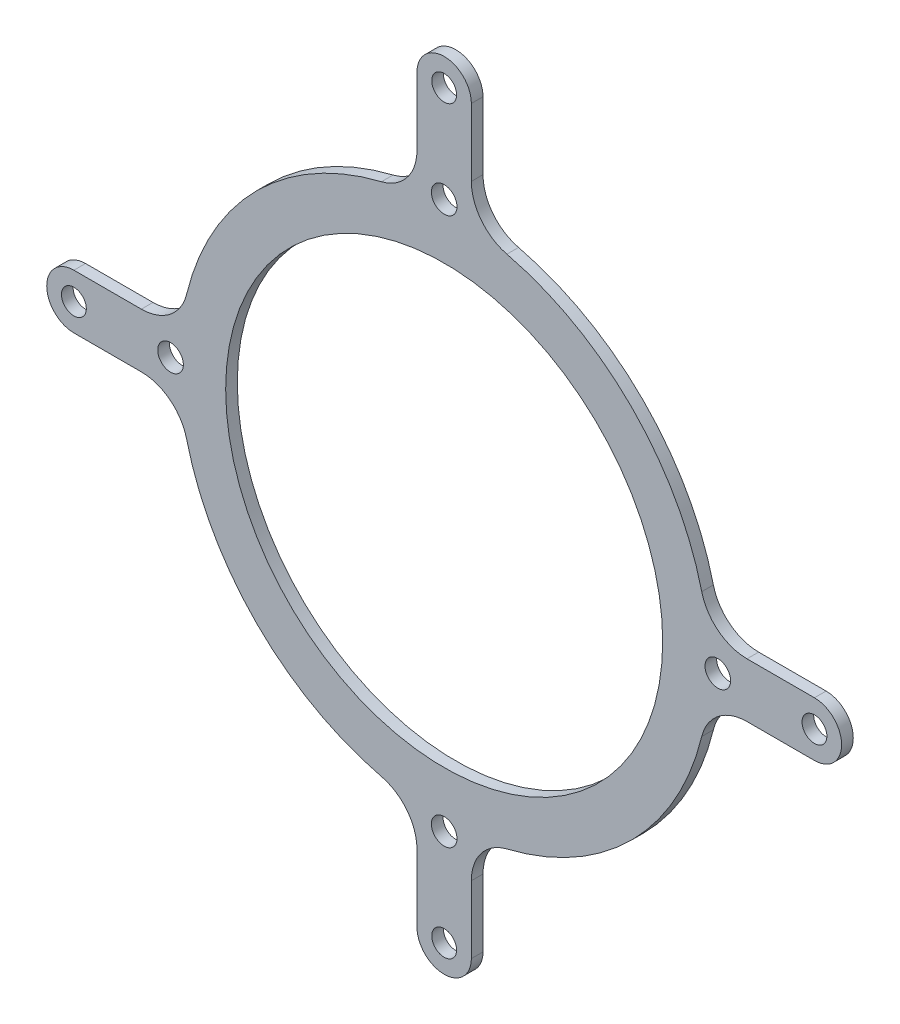
ISO-10303-21;
HEADER;
FILE_DESCRIPTION(('STEP AP214'),'2;1');
FILE_NAME('part.step','',(''),(''),'','','');
FILE_SCHEMA(('AUTOMOTIVE_DESIGN { 1 0 10303 214 1 1 1 1 }'));
ENDSEC;
DATA;
#1=APPLICATION_CONTEXT('core data for automotive mechanical design processes');
#2=APPLICATION_PROTOCOL_DEFINITION('international standard','automotive_design',2000,#1);
#3=PRODUCT_CONTEXT('',#1,'mechanical');
#4=PRODUCT('Part','Part','',(#3));
#5=PRODUCT_RELATED_PRODUCT_CATEGORY('part','',(#4));
#6=PRODUCT_DEFINITION_FORMATION('','',#4);
#7=PRODUCT_DEFINITION_CONTEXT('part definition',#1,'design');
#8=PRODUCT_DEFINITION('design','',#6,#7);
#9=PRODUCT_DEFINITION_SHAPE('','',#8);
#10=(LENGTH_UNIT() NAMED_UNIT(*) SI_UNIT(.MILLI.,.METRE.));
#11=(NAMED_UNIT(*) PLANE_ANGLE_UNIT() SI_UNIT($,.RADIAN.));
#12=(NAMED_UNIT(*) SI_UNIT($,.STERADIAN.) SOLID_ANGLE_UNIT());
#13=UNCERTAINTY_MEASURE_WITH_UNIT(LENGTH_MEASURE(1.E-05),#10,'distance_accuracy_value','');
#14=(GEOMETRIC_REPRESENTATION_CONTEXT(3) GLOBAL_UNCERTAINTY_ASSIGNED_CONTEXT((#13)) GLOBAL_UNIT_ASSIGNED_CONTEXT((#10,
#11,#12)) REPRESENTATION_CONTEXT('',''));
#15=CARTESIAN_POINT('',(0.,0.,0.));
#16=DIRECTION('',(0.,0.,1.));
#17=DIRECTION('',(1.,0.,0.));
#18=AXIS2_PLACEMENT_3D('',#15,#16,#17);
#19=CARTESIAN_POINT('',(0.,0.,1.5));
#20=DIRECTION('',(0.,0.,-1.));
#21=DIRECTION('',(-1.,0.,0.));
#22=AXIS2_PLACEMENT_3D('',#19,#20,#21);
#23=CYLINDRICAL_SURFACE('',#22,34.15);
#24=CARTESIAN_POINT('',(0.,0.,1.5));
#25=DIRECTION('',(0.,0.,1.));
#26=DIRECTION('',(1.,0.,0.));
#27=AXIS2_PLACEMENT_3D('',#24,#25,#26);
#28=CIRCLE('',#27,34.15);
#29=CARTESIAN_POINT('',(-8.08032378580324,33.180278291729,1.5));
#30=VERTEX_POINT('',#29);
#31=CARTESIAN_POINT('',(-33.180278291729,8.08032378580323,1.5));
#32=VERTEX_POINT('',#31);
#33=EDGE_CURVE('E224',#30,#32,#28,.T.);
#34=ORIENTED_EDGE('',*,*,#33,.F.);
#35=DIRECTION('',(0.,0.,-1.));
#36=VECTOR('',#35,1.);
#37=CARTESIAN_POINT('',(-8.08032378580324,33.180278291729,1.5));
#38=LINE('',#37,#36);
#39=CARTESIAN_POINT('',(-8.08032378580324,33.180278291729,0.));
#40=VERTEX_POINT('',#39);
#41=EDGE_CURVE('E339',#30,#40,#38,.T.);
#42=ORIENTED_EDGE('',*,*,#41,.T.);
#43=CARTESIAN_POINT('',(0.,0.,0.));
#44=DIRECTION('',(0.,0.,1.));
#45=DIRECTION('',(1.,0.,0.));
#46=AXIS2_PLACEMENT_3D('',#43,#44,#45);
#47=CIRCLE('',#46,34.15);
#48=CARTESIAN_POINT('',(-33.180278291729,8.08032378580323,0.));
#49=VERTEX_POINT('',#48);
#50=EDGE_CURVE('E279',#40,#49,#47,.T.);
#51=ORIENTED_EDGE('',*,*,#50,.T.);
#52=DIRECTION('',(0.,0.,-1.));
#53=VECTOR('',#52,1.);
#54=CARTESIAN_POINT('',(-33.180278291729,8.08032378580323,1.5));
#55=LINE('',#54,#53);
#56=EDGE_CURVE('E210',#49,#32,#55,.F.);
#57=ORIENTED_EDGE('',*,*,#56,.T.);
#58=EDGE_LOOP('',(#34,#42,#51,#57));
#59=FACE_BOUND('',#58,.T.);
#60=ADVANCED_FACE('F40',(#59),#23,.T.);
#61=CARTESIAN_POINT('',(0.,3.5,1.5));
#62=DIRECTION('',(0.,1.,0.));
#63=DIRECTION('',(-1.,0.,0.));
#64=AXIS2_PLACEMENT_3D('',#61,#62,#63);
#65=PLANE('',#64);
#66=DIRECTION('',(1.,0.,0.));
#67=VECTOR('',#66,1.);
#68=CARTESIAN_POINT('',(0.,3.5,1.5));
#69=LINE('',#68,#67);
#70=CARTESIAN_POINT('',(-47.7,3.49999999999999,1.5));
#71=VERTEX_POINT('',#70);
#72=CARTESIAN_POINT('',(-39.0099025889581,3.49999999999999,1.5));
#73=VERTEX_POINT('',#72);
#74=EDGE_CURVE('E205',#71,#73,#69,.T.);
#75=ORIENTED_EDGE('',*,*,#74,.T.);
#76=DIRECTION('',(0.,0.,-1.));
#77=VECTOR('',#76,1.);
#78=CARTESIAN_POINT('',(-39.0099025889581,3.49999999999999,1.5));
#79=LINE('',#78,#77);
#80=CARTESIAN_POINT('',(-39.0099025889581,3.49999999999999,0.));
#81=VERTEX_POINT('',#80);
#82=EDGE_CURVE('E374',#73,#81,#79,.T.);
#83=ORIENTED_EDGE('',*,*,#82,.T.);
#84=DIRECTION('',(1.,0.,0.));
#85=VECTOR('',#84,1.);
#86=CARTESIAN_POINT('',(0.,3.5,0.));
#87=LINE('',#86,#85);
#88=CARTESIAN_POINT('',(-47.7,3.49999999999999,0.));
#89=VERTEX_POINT('',#88);
#90=EDGE_CURVE('E207',#89,#81,#87,.T.);
#91=ORIENTED_EDGE('',*,*,#90,.F.);
#92=DIRECTION('',(0.,0.,-1.));
#93=VECTOR('',#92,1.);
#94=CARTESIAN_POINT('',(-47.7,3.49999999999999,1.5));
#95=LINE('',#94,#93);
#96=EDGE_CURVE('E202',#71,#89,#95,.T.);
#97=ORIENTED_EDGE('',*,*,#96,.F.);
#98=EDGE_LOOP('',(#75,#83,#91,#97));
#99=FACE_BOUND('',#98,.T.);
#100=ADVANCED_FACE('F204',(#99),#65,.T.);
#101=CARTESIAN_POINT('',(-47.7,0.,1.5));
#102=DIRECTION('',(0.,0.,-1.));
#103=DIRECTION('',(-1.,0.,0.));
#104=AXIS2_PLACEMENT_3D('',#101,#102,#103);
#105=CYLINDRICAL_SURFACE('',#104,3.49999999999999);
#106=CARTESIAN_POINT('',(-47.7,0.,0.));
#107=DIRECTION('',(0.,0.,1.));
#108=DIRECTION('',(1.,0.,0.));
#109=AXIS2_PLACEMENT_3D('',#106,#107,#108);
#110=CIRCLE('',#109,3.49999999999999);
#111=CARTESIAN_POINT('',(-47.7,-3.49999999999999,0.));
#112=VERTEX_POINT('',#111);
#113=EDGE_CURVE('E281',#89,#112,#110,.T.);
#114=ORIENTED_EDGE('',*,*,#113,.T.);
#115=DIRECTION('',(0.,0.,-1.));
#116=VECTOR('',#115,1.);
#117=CARTESIAN_POINT('',(-47.7,-3.49999999999999,1.5));
#118=LINE('',#117,#116);
#119=CARTESIAN_POINT('',(-47.7,-3.49999999999999,1.5));
#120=VERTEX_POINT('',#119);
#121=EDGE_CURVE('E211',#120,#112,#118,.T.);
#122=ORIENTED_EDGE('',*,*,#121,.F.);
#123=CARTESIAN_POINT('',(-47.7,0.,1.5));
#124=DIRECTION('',(0.,0.,1.));
#125=DIRECTION('',(1.,0.,0.));
#126=AXIS2_PLACEMENT_3D('',#123,#124,#125);
#127=CIRCLE('',#126,3.49999999999999);
#128=EDGE_CURVE('E214',#71,#120,#127,.T.);
#129=ORIENTED_EDGE('',*,*,#128,.F.);
#130=ORIENTED_EDGE('',*,*,#96,.T.);
#131=EDGE_LOOP('',(#114,#122,#129,#130));
#132=FACE_BOUND('',#131,.T.);
#133=ADVANCED_FACE('F215',(#132),#105,.T.);
#134=CARTESIAN_POINT('',(0.,-3.49999999999997,1.5));
#135=DIRECTION('',(0.,1.,0.));
#136=DIRECTION('',(-1.,0.,0.));
#137=AXIS2_PLACEMENT_3D('',#134,#135,#136);
#138=PLANE('',#137);
#139=DIRECTION('',(1.,0.,0.));
#140=VECTOR('',#139,1.);
#141=CARTESIAN_POINT('',(0.,-3.49999999999997,0.));
#142=LINE('',#141,#140);
#143=CARTESIAN_POINT('',(-39.0099025889581,-3.49999999999998,0.));
#144=VERTEX_POINT('',#143);
#145=EDGE_CURVE('E277',#112,#144,#142,.T.);
#146=ORIENTED_EDGE('',*,*,#145,.T.);
#147=DIRECTION('',(0.,0.,1.));
#148=VECTOR('',#147,1.);
#149=CARTESIAN_POINT('',(-39.0099025889581,-3.49999999999998,1.5));
#150=LINE('',#149,#148);
#151=CARTESIAN_POINT('',(-39.0099025889581,-3.49999999999998,1.5));
#152=VERTEX_POINT('',#151);
#153=EDGE_CURVE('E372',#144,#152,#150,.T.);
#154=ORIENTED_EDGE('',*,*,#153,.T.);
#155=DIRECTION('',(1.,0.,0.));
#156=VECTOR('',#155,1.);
#157=CARTESIAN_POINT('',(0.,-3.49999999999997,1.5));
#158=LINE('',#157,#156);
#159=EDGE_CURVE('E219',#120,#152,#158,.T.);
#160=ORIENTED_EDGE('',*,*,#159,.F.);
#161=ORIENTED_EDGE('',*,*,#121,.T.);
#162=EDGE_LOOP('',(#146,#154,#160,#161));
#163=FACE_BOUND('',#162,.T.);
#164=ADVANCED_FACE('F519',(#163),#138,.F.);
#165=CARTESIAN_POINT('',(-33.180278291729,-8.08032378580323,0.));
#166=VERTEX_POINT('',#165);
#167=CARTESIAN_POINT('',(-8.08032378580323,-33.180278291729,0.));
#168=VERTEX_POINT('',#167);
#169=EDGE_CURVE('E273',#166,#168,#47,.T.);
#170=ORIENTED_EDGE('',*,*,#169,.T.);
#171=DIRECTION('',(0.,0.,-1.));
#172=VECTOR('',#171,1.);
#173=CARTESIAN_POINT('',(-8.08032378580323,-33.180278291729,1.5));
#174=LINE('',#173,#172);
#175=CARTESIAN_POINT('',(-8.08032378580323,-33.180278291729,1.5));
#176=VERTEX_POINT('',#175);
#177=EDGE_CURVE('E370',#168,#176,#174,.F.);
#178=ORIENTED_EDGE('',*,*,#177,.T.);
#179=CARTESIAN_POINT('',(-33.180278291729,-8.08032378580323,1.5));
#180=VERTEX_POINT('',#179);
#181=EDGE_CURVE('E228',#180,#176,#28,.T.);
#182=ORIENTED_EDGE('',*,*,#181,.F.);
#183=DIRECTION('',(0.,0.,-1.));
#184=VECTOR('',#183,1.);
#185=CARTESIAN_POINT('',(-33.180278291729,-8.08032378580323,1.5));
#186=LINE('',#185,#184);
#187=EDGE_CURVE('E367',#180,#166,#186,.T.);
#188=ORIENTED_EDGE('',*,*,#187,.T.);
#189=EDGE_LOOP('',(#170,#178,#182,#188));
#190=FACE_BOUND('',#189,.T.);
#191=ADVANCED_FACE('F510',(#190),#23,.T.);
#192=CARTESIAN_POINT('',(-3.5,0.,1.5));
#193=DIRECTION('',(-1.,0.,0.));
#194=DIRECTION('',(0.,-1.,0.));
#195=AXIS2_PLACEMENT_3D('',#192,#193,#194);
#196=PLANE('',#195);
#197=DIRECTION('',(0.,1.,0.));
#198=VECTOR('',#197,1.);
#199=CARTESIAN_POINT('',(-3.5,0.,1.5));
#200=LINE('',#199,#198);
#201=CARTESIAN_POINT('',(-3.49999999999999,-47.7,1.5));
#202=VERTEX_POINT('',#201);
#203=CARTESIAN_POINT('',(-3.49999999999999,-39.0099025889581,1.5));
#204=VERTEX_POINT('',#203);
#205=EDGE_CURVE('E233',#202,#204,#200,.T.);
#206=ORIENTED_EDGE('',*,*,#205,.T.);
#207=DIRECTION('',(0.,0.,-1.));
#208=VECTOR('',#207,1.);
#209=CARTESIAN_POINT('',(-3.49999999999999,-39.0099025889581,1.5));
#210=LINE('',#209,#208);
#211=CARTESIAN_POINT('',(-3.49999999999999,-39.0099025889581,0.));
#212=VERTEX_POINT('',#211);
#213=EDGE_CURVE('E364',#204,#212,#210,.T.);
#214=ORIENTED_EDGE('',*,*,#213,.T.);
#215=DIRECTION('',(0.,1.,0.));
#216=VECTOR('',#215,1.);
#217=CARTESIAN_POINT('',(-3.5,0.,0.));
#218=LINE('',#217,#216);
#219=CARTESIAN_POINT('',(-3.49999999999999,-47.7,0.));
#220=VERTEX_POINT('',#219);
#221=EDGE_CURVE('E276',#220,#212,#218,.T.);
#222=ORIENTED_EDGE('',*,*,#221,.F.);
#223=DIRECTION('',(0.,0.,-1.));
#224=VECTOR('',#223,1.);
#225=CARTESIAN_POINT('',(-3.49999999999999,-47.7,1.5));
#226=LINE('',#225,#224);
#227=EDGE_CURVE('E335',#202,#220,#226,.T.);
#228=ORIENTED_EDGE('',*,*,#227,.F.);
#229=EDGE_LOOP('',(#206,#214,#222,#228));
#230=FACE_BOUND('',#229,.T.);
#231=ADVANCED_FACE('F484',(#230),#196,.T.);
#232=CARTESIAN_POINT('',(0.,-47.7,1.5));
#233=DIRECTION('',(0.,0.,-1.));
#234=DIRECTION('',(-1.,0.,0.));
#235=AXIS2_PLACEMENT_3D('',#232,#233,#234);
#236=CYLINDRICAL_SURFACE('',#235,3.5);
#237=CARTESIAN_POINT('',(0.,-47.7,0.));
#238=DIRECTION('',(0.,0.,1.));
#239=DIRECTION('',(1.,0.,0.));
#240=AXIS2_PLACEMENT_3D('',#237,#238,#239);
#241=CIRCLE('',#240,3.5);
#242=CARTESIAN_POINT('',(3.50000000000001,-47.7,0.));
#243=VERTEX_POINT('',#242);
#244=EDGE_CURVE('E287',#220,#243,#241,.T.);
#245=ORIENTED_EDGE('',*,*,#244,.T.);
#246=DIRECTION('',(0.,0.,-1.));
#247=VECTOR('',#246,1.);
#248=CARTESIAN_POINT('',(3.50000000000001,-47.7,1.5));
#249=LINE('',#248,#247);
#250=CARTESIAN_POINT('',(3.50000000000001,-47.7,1.5));
#251=VERTEX_POINT('',#250);
#252=EDGE_CURVE('E332',#251,#243,#249,.T.);
#253=ORIENTED_EDGE('',*,*,#252,.F.);
#254=CARTESIAN_POINT('',(0.,-47.7,1.5));
#255=DIRECTION('',(0.,0.,1.));
#256=DIRECTION('',(1.,0.,0.));
#257=AXIS2_PLACEMENT_3D('',#254,#255,#256);
#258=CIRCLE('',#257,3.5);
#259=EDGE_CURVE('E236',#202,#251,#258,.T.);
#260=ORIENTED_EDGE('',*,*,#259,.F.);
#261=ORIENTED_EDGE('',*,*,#227,.T.);
#262=EDGE_LOOP('',(#245,#253,#260,#261));
#263=FACE_BOUND('',#262,.T.);
#264=ADVANCED_FACE('F490',(#263),#236,.T.);
#265=CARTESIAN_POINT('',(3.49999999999999,0.,1.5));
#266=DIRECTION('',(-1.,0.,0.));
#267=DIRECTION('',(0.,-1.,0.));
#268=AXIS2_PLACEMENT_3D('',#265,#266,#267);
#269=PLANE('',#268);
#270=DIRECTION('',(0.,1.,0.));
#271=VECTOR('',#270,1.);
#272=CARTESIAN_POINT('',(3.49999999999999,0.,0.));
#273=LINE('',#272,#271);
#274=CARTESIAN_POINT('',(3.5,-39.0099025889581,0.));
#275=VERTEX_POINT('',#274);
#276=EDGE_CURVE('E289',#243,#275,#273,.T.);
#277=ORIENTED_EDGE('',*,*,#276,.T.);
#278=DIRECTION('',(0.,0.,1.));
#279=VECTOR('',#278,1.);
#280=CARTESIAN_POINT('',(3.5,-39.0099025889581,1.5));
#281=LINE('',#280,#279);
#282=CARTESIAN_POINT('',(3.5,-39.0099025889581,1.5));
#283=VERTEX_POINT('',#282);
#284=EDGE_CURVE('E362',#275,#283,#281,.T.);
#285=ORIENTED_EDGE('',*,*,#284,.T.);
#286=DIRECTION('',(0.,1.,0.));
#287=VECTOR('',#286,1.);
#288=CARTESIAN_POINT('',(3.49999999999999,0.,1.5));
#289=LINE('',#288,#287);
#290=EDGE_CURVE('E238',#251,#283,#289,.T.);
#291=ORIENTED_EDGE('',*,*,#290,.F.);
#292=ORIENTED_EDGE('',*,*,#252,.T.);
#293=EDGE_LOOP('',(#277,#285,#291,#292));
#294=FACE_BOUND('',#293,.T.);
#295=ADVANCED_FACE('F494',(#294),#269,.F.);
#296=CARTESIAN_POINT('',(8.08032378580324,-33.180278291729,0.));
#297=VERTEX_POINT('',#296);
#298=CARTESIAN_POINT('',(33.180278291729,-8.08032378580324,0.));
#299=VERTEX_POINT('',#298);
#300=EDGE_CURVE('E278',#297,#299,#47,.T.);
#301=ORIENTED_EDGE('',*,*,#300,.T.);
#302=DIRECTION('',(0.,0.,-1.));
#303=VECTOR('',#302,1.);
#304=CARTESIAN_POINT('',(33.180278291729,-8.08032378580324,1.5));
#305=LINE('',#304,#303);
#306=CARTESIAN_POINT('',(33.180278291729,-8.08032378580324,1.5));
#307=VERTEX_POINT('',#306);
#308=EDGE_CURVE('E360',#299,#307,#305,.F.);
#309=ORIENTED_EDGE('',*,*,#308,.T.);
#310=CARTESIAN_POINT('',(8.08032378580324,-33.180278291729,1.5));
#311=VERTEX_POINT('',#310);
#312=EDGE_CURVE('E241',#311,#307,#28,.T.);
#313=ORIENTED_EDGE('',*,*,#312,.F.);
#314=DIRECTION('',(0.,0.,-1.));
#315=VECTOR('',#314,1.);
#316=CARTESIAN_POINT('',(8.08032378580324,-33.180278291729,1.5));
#317=LINE('',#316,#315);
#318=EDGE_CURVE('E357',#311,#297,#317,.T.);
#319=ORIENTED_EDGE('',*,*,#318,.T.);
#320=EDGE_LOOP('',(#301,#309,#313,#319));
#321=FACE_BOUND('',#320,.T.);
#322=ADVANCED_FACE('F429',(#321),#23,.T.);
#323=CARTESIAN_POINT('',(0.,-3.50000000000002,1.5));
#324=DIRECTION('',(0.,-1.,0.));
#325=DIRECTION('',(1.,0.,0.));
#326=AXIS2_PLACEMENT_3D('',#323,#324,#325);
#327=PLANE('',#326);
#328=DIRECTION('',(-1.,0.,0.));
#329=VECTOR('',#328,1.);
#330=CARTESIAN_POINT('',(0.,-3.50000000000002,1.5));
#331=LINE('',#330,#329);
#332=CARTESIAN_POINT('',(47.7,-3.5,1.5));
#333=VERTEX_POINT('',#332);
#334=CARTESIAN_POINT('',(39.0099025889581,-3.5,1.5));
#335=VERTEX_POINT('',#334);
#336=EDGE_CURVE('E242',#333,#335,#331,.T.);
#337=ORIENTED_EDGE('',*,*,#336,.T.);
#338=DIRECTION('',(0.,0.,-1.));
#339=VECTOR('',#338,1.);
#340=CARTESIAN_POINT('',(39.0099025889581,-3.5,1.5));
#341=LINE('',#340,#339);
#342=CARTESIAN_POINT('',(39.0099025889581,-3.5,0.));
#343=VERTEX_POINT('',#342);
#344=EDGE_CURVE('E354',#335,#343,#341,.T.);
#345=ORIENTED_EDGE('',*,*,#344,.T.);
#346=DIRECTION('',(-1.,0.,0.));
#347=VECTOR('',#346,1.);
#348=CARTESIAN_POINT('',(0.,-3.50000000000002,0.));
#349=LINE('',#348,#347);
#350=CARTESIAN_POINT('',(47.7,-3.5,0.));
#351=VERTEX_POINT('',#350);
#352=EDGE_CURVE('E292',#351,#343,#349,.T.);
#353=ORIENTED_EDGE('',*,*,#352,.F.);
#354=DIRECTION('',(0.,0.,-1.));
#355=VECTOR('',#354,1.);
#356=CARTESIAN_POINT('',(47.7,-3.5,1.5));
#357=LINE('',#356,#355);
#358=EDGE_CURVE('E330',#333,#351,#357,.T.);
#359=ORIENTED_EDGE('',*,*,#358,.F.);
#360=EDGE_LOOP('',(#337,#345,#353,#359));
#361=FACE_BOUND('',#360,.T.);
#362=ADVANCED_FACE('F440',(#361),#327,.T.);
#363=CARTESIAN_POINT('',(47.7,0.,1.5));
#364=DIRECTION('',(0.,0.,-1.));
#365=DIRECTION('',(-1.,0.,0.));
#366=AXIS2_PLACEMENT_3D('',#363,#364,#365);
#367=CYLINDRICAL_SURFACE('',#366,3.5);
#368=CARTESIAN_POINT('',(47.7,0.,0.));
#369=DIRECTION('',(0.,0.,1.));
#370=DIRECTION('',(1.,0.,0.));
#371=AXIS2_PLACEMENT_3D('',#368,#369,#370);
#372=CIRCLE('',#371,3.5);
#373=CARTESIAN_POINT('',(47.7,3.5,0.));
#374=VERTEX_POINT('',#373);
#375=EDGE_CURVE('E295',#351,#374,#372,.T.);
#376=ORIENTED_EDGE('',*,*,#375,.T.);
#377=DIRECTION('',(0.,0.,-1.));
#378=VECTOR('',#377,1.);
#379=CARTESIAN_POINT('',(47.7,3.5,1.5));
#380=LINE('',#379,#378);
#381=CARTESIAN_POINT('',(47.7,3.5,1.5));
#382=VERTEX_POINT('',#381);
#383=EDGE_CURVE('E327',#382,#374,#380,.T.);
#384=ORIENTED_EDGE('',*,*,#383,.F.);
#385=CARTESIAN_POINT('',(47.7,0.,1.5));
#386=DIRECTION('',(0.,0.,1.));
#387=DIRECTION('',(1.,0.,0.));
#388=AXIS2_PLACEMENT_3D('',#385,#386,#387);
#389=CIRCLE('',#388,3.5);
#390=EDGE_CURVE('E245',#333,#382,#389,.T.);
#391=ORIENTED_EDGE('',*,*,#390,.F.);
#392=ORIENTED_EDGE('',*,*,#358,.T.);
#393=EDGE_LOOP('',(#376,#384,#391,#392));
#394=FACE_BOUND('',#393,.T.);
#395=ADVANCED_FACE('F446',(#394),#367,.T.);
#396=CARTESIAN_POINT('',(0.,3.49999999999998,1.5));
#397=DIRECTION('',(0.,-1.,0.));
#398=DIRECTION('',(1.,0.,0.));
#399=AXIS2_PLACEMENT_3D('',#396,#397,#398);
#400=PLANE('',#399);
#401=DIRECTION('',(-1.,0.,0.));
#402=VECTOR('',#401,1.);
#403=CARTESIAN_POINT('',(0.,3.49999999999998,0.));
#404=LINE('',#403,#402);
#405=CARTESIAN_POINT('',(39.0099025889581,3.5,0.));
#406=VERTEX_POINT('',#405);
#407=EDGE_CURVE('E297',#374,#406,#404,.T.);
#408=ORIENTED_EDGE('',*,*,#407,.T.);
#409=DIRECTION('',(0.,0.,1.));
#410=VECTOR('',#409,1.);
#411=CARTESIAN_POINT('',(39.0099025889581,3.5,1.5));
#412=LINE('',#411,#410);
#413=CARTESIAN_POINT('',(39.0099025889581,3.5,1.5));
#414=VERTEX_POINT('',#413);
#415=EDGE_CURVE('E352',#406,#414,#412,.T.);
#416=ORIENTED_EDGE('',*,*,#415,.T.);
#417=DIRECTION('',(-1.,0.,0.));
#418=VECTOR('',#417,1.);
#419=CARTESIAN_POINT('',(0.,3.49999999999998,1.5));
#420=LINE('',#419,#418);
#421=EDGE_CURVE('E247',#382,#414,#420,.T.);
#422=ORIENTED_EDGE('',*,*,#421,.F.);
#423=ORIENTED_EDGE('',*,*,#383,.T.);
#424=EDGE_LOOP('',(#408,#416,#422,#423));
#425=FACE_BOUND('',#424,.T.);
#426=ADVANCED_FACE('F521',(#425),#400,.F.);
#427=CARTESIAN_POINT('',(33.180278291729,8.08032378580324,0.));
#428=VERTEX_POINT('',#427);
#429=CARTESIAN_POINT('',(8.08032378580324,33.180278291729,0.));
#430=VERTEX_POINT('',#429);
#431=EDGE_CURVE('E300',#428,#430,#47,.T.);
#432=ORIENTED_EDGE('',*,*,#431,.T.);
#433=DIRECTION('',(0.,0.,-1.));
#434=VECTOR('',#433,1.);
#435=CARTESIAN_POINT('',(8.08032378580324,33.180278291729,1.5));
#436=LINE('',#435,#434);
#437=CARTESIAN_POINT('',(8.08032378580324,33.180278291729,1.5));
#438=VERTEX_POINT('',#437);
#439=EDGE_CURVE('E350',#430,#438,#436,.F.);
#440=ORIENTED_EDGE('',*,*,#439,.T.);
#441=CARTESIAN_POINT('',(33.180278291729,8.08032378580324,1.5));
#442=VERTEX_POINT('',#441);
#443=EDGE_CURVE('E229',#442,#438,#28,.T.);
#444=ORIENTED_EDGE('',*,*,#443,.F.);
#445=DIRECTION('',(0.,0.,-1.));
#446=VECTOR('',#445,1.);
#447=CARTESIAN_POINT('',(33.180278291729,8.08032378580324,1.5));
#448=LINE('',#447,#446);
#449=EDGE_CURVE('E347',#442,#428,#448,.T.);
#450=ORIENTED_EDGE('',*,*,#449,.T.);
#451=EDGE_LOOP('',(#432,#440,#444,#450));
#452=FACE_BOUND('',#451,.T.);
#453=ADVANCED_FACE('F456',(#452),#23,.T.);
#454=CARTESIAN_POINT('',(3.50000000000001,0.,1.5));
#455=DIRECTION('',(1.,0.,0.));
#456=DIRECTION('',(0.,1.,0.));
#457=AXIS2_PLACEMENT_3D('',#454,#455,#456);
#458=PLANE('',#457);
#459=DIRECTION('',(0.,-1.,0.));
#460=VECTOR('',#459,1.);
#461=CARTESIAN_POINT('',(3.50000000000001,0.,1.5));
#462=LINE('',#461,#460);
#463=CARTESIAN_POINT('',(3.5,47.7,1.5));
#464=VERTEX_POINT('',#463);
#465=CARTESIAN_POINT('',(3.5,39.0099025889581,1.5));
#466=VERTEX_POINT('',#465);
#467=EDGE_CURVE('E250',#464,#466,#462,.T.);
#468=ORIENTED_EDGE('',*,*,#467,.T.);
#469=DIRECTION('',(0.,0.,-1.));
#470=VECTOR('',#469,1.);
#471=CARTESIAN_POINT('',(3.5,39.0099025889581,1.5));
#472=LINE('',#471,#470);
#473=CARTESIAN_POINT('',(3.5,39.0099025889581,0.));
#474=VERTEX_POINT('',#473);
#475=EDGE_CURVE('E344',#466,#474,#472,.T.);
#476=ORIENTED_EDGE('',*,*,#475,.T.);
#477=DIRECTION('',(0.,-1.,0.));
#478=VECTOR('',#477,1.);
#479=CARTESIAN_POINT('',(3.50000000000001,0.,0.));
#480=LINE('',#479,#478);
#481=CARTESIAN_POINT('',(3.5,47.7,0.));
#482=VERTEX_POINT('',#481);
#483=EDGE_CURVE('E301',#482,#474,#480,.T.);
#484=ORIENTED_EDGE('',*,*,#483,.F.);
#485=DIRECTION('',(0.,0.,-1.));
#486=VECTOR('',#485,1.);
#487=CARTESIAN_POINT('',(3.5,47.7,1.5));
#488=LINE('',#487,#486);
#489=EDGE_CURVE('E325',#464,#482,#488,.T.);
#490=ORIENTED_EDGE('',*,*,#489,.F.);
#491=EDGE_LOOP('',(#468,#476,#484,#490));
#492=FACE_BOUND('',#491,.T.);
#493=ADVANCED_FACE('F467',(#492),#458,.T.);
#494=CARTESIAN_POINT('',(0.,47.7,1.5));
#495=DIRECTION('',(0.,0.,-1.));
#496=DIRECTION('',(-1.,0.,0.));
#497=AXIS2_PLACEMENT_3D('',#494,#495,#496);
#498=CYLINDRICAL_SURFACE('',#497,3.5);
#499=CARTESIAN_POINT('',(0.,47.7,0.));
#500=DIRECTION('',(0.,0.,1.));
#501=DIRECTION('',(1.,0.,0.));
#502=AXIS2_PLACEMENT_3D('',#499,#500,#501);
#503=CIRCLE('',#502,3.5);
#504=CARTESIAN_POINT('',(-3.5,47.7,0.));
#505=VERTEX_POINT('',#504);
#506=EDGE_CURVE('E304',#482,#505,#503,.T.);
#507=ORIENTED_EDGE('',*,*,#506,.T.);
#508=DIRECTION('',(0.,0.,-1.));
#509=VECTOR('',#508,1.);
#510=CARTESIAN_POINT('',(-3.5,47.7,1.5));
#511=LINE('',#510,#509);
#512=CARTESIAN_POINT('',(-3.5,47.7,1.5));
#513=VERTEX_POINT('',#512);
#514=EDGE_CURVE('E272',#513,#505,#511,.T.);
#515=ORIENTED_EDGE('',*,*,#514,.F.);
#516=CARTESIAN_POINT('',(0.,47.7,1.5));
#517=DIRECTION('',(0.,0.,1.));
#518=DIRECTION('',(1.,0.,0.));
#519=AXIS2_PLACEMENT_3D('',#516,#517,#518);
#520=CIRCLE('',#519,3.5);
#521=EDGE_CURVE('E253',#464,#513,#520,.T.);
#522=ORIENTED_EDGE('',*,*,#521,.F.);
#523=ORIENTED_EDGE('',*,*,#489,.T.);
#524=EDGE_LOOP('',(#507,#515,#522,#523));
#525=FACE_BOUND('',#524,.T.);
#526=ADVANCED_FACE('F526',(#525),#498,.T.);
#527=CARTESIAN_POINT('',(-3.5,0.,1.5));
#528=DIRECTION('',(1.,0.,0.));
#529=DIRECTION('',(0.,1.,0.));
#530=AXIS2_PLACEMENT_3D('',#527,#528,#529);
#531=PLANE('',#530);
#532=DIRECTION('',(0.,-1.,0.));
#533=VECTOR('',#532,1.);
#534=CARTESIAN_POINT('',(-3.5,0.,0.));
#535=LINE('',#534,#533);
#536=CARTESIAN_POINT('',(-3.5,39.0099025889581,0.));
#537=VERTEX_POINT('',#536);
#538=EDGE_CURVE('E306',#505,#537,#535,.T.);
#539=ORIENTED_EDGE('',*,*,#538,.T.);
#540=DIRECTION('',(0.,0.,1.));
#541=VECTOR('',#540,1.);
#542=CARTESIAN_POINT('',(-3.5,39.0099025889581,1.5));
#543=LINE('',#542,#541);
#544=CARTESIAN_POINT('',(-3.5,39.0099025889581,1.5));
#545=VERTEX_POINT('',#544);
#546=EDGE_CURVE('E342',#537,#545,#543,.T.);
#547=ORIENTED_EDGE('',*,*,#546,.T.);
#548=DIRECTION('',(0.,-1.,0.));
#549=VECTOR('',#548,1.);
#550=CARTESIAN_POINT('',(-3.5,0.,1.5));
#551=LINE('',#550,#549);
#552=EDGE_CURVE('E255',#513,#545,#551,.T.);
#553=ORIENTED_EDGE('',*,*,#552,.F.);
#554=ORIENTED_EDGE('',*,*,#514,.T.);
#555=EDGE_LOOP('',(#539,#547,#553,#554));
#556=FACE_BOUND('',#555,.T.);
#557=ADVANCED_FACE('F656',(#556),#531,.F.);
#558=CARTESIAN_POINT('',(0.,-47.7,1.5));
#559=DIRECTION('',(0.,0.,-1.));
#560=DIRECTION('',(-1.,0.,0.));
#561=AXIS2_PLACEMENT_3D('',#558,#559,#560);
#562=CYLINDRICAL_SURFACE('',#561,1.6);
#563=CARTESIAN_POINT('',(0.,-47.7,1.5));
#564=DIRECTION('',(0.,0.,1.));
#565=DIRECTION('',(1.,0.,0.));
#566=AXIS2_PLACEMENT_3D('',#563,#564,#565);
#567=CIRCLE('',#566,1.6);
#568=CARTESIAN_POINT('',(1.6,-47.7,1.5));
#569=VERTEX_POINT('',#568);
#570=EDGE_CURVE('E266',#569,#569,#567,.T.);
#571=ORIENTED_EDGE('',*,*,#570,.T.);
#572=EDGE_LOOP('',(#571));
#573=FACE_BOUND('',#572,.T.);
#574=CARTESIAN_POINT('',(0.,-47.7,0.));
#575=DIRECTION('',(0.,0.,1.));
#576=DIRECTION('',(1.,0.,0.));
#577=AXIS2_PLACEMENT_3D('',#574,#575,#576);
#578=CIRCLE('',#577,1.6);
#579=CARTESIAN_POINT('',(1.6,-47.7,0.));
#580=VERTEX_POINT('',#579);
#581=EDGE_CURVE('E318',#580,#580,#578,.T.);
#582=ORIENTED_EDGE('',*,*,#581,.F.);
#583=EDGE_LOOP('',(#582));
#584=FACE_BOUND('',#583,.T.);
#585=ADVANCED_FACE('F652',(#573,#584),#562,.F.);
#586=CARTESIAN_POINT('',(47.7,0.,1.5));
#587=DIRECTION('',(0.,0.,-1.));
#588=DIRECTION('',(-1.,0.,0.));
#589=AXIS2_PLACEMENT_3D('',#586,#587,#588);
#590=CYLINDRICAL_SURFACE('',#589,1.6);
#591=CARTESIAN_POINT('',(47.7,0.,1.5));
#592=DIRECTION('',(0.,0.,1.));
#593=DIRECTION('',(1.,0.,0.));
#594=AXIS2_PLACEMENT_3D('',#591,#592,#593);
#595=CIRCLE('',#594,1.6);
#596=CARTESIAN_POINT('',(49.3,0.,1.5));
#597=VERTEX_POINT('',#596);
#598=EDGE_CURVE('E263',#597,#597,#595,.T.);
#599=ORIENTED_EDGE('',*,*,#598,.T.);
#600=EDGE_LOOP('',(#599));
#601=FACE_BOUND('',#600,.T.);
#602=CARTESIAN_POINT('',(47.7,0.,0.));
#603=DIRECTION('',(0.,0.,1.));
#604=DIRECTION('',(1.,0.,0.));
#605=AXIS2_PLACEMENT_3D('',#602,#603,#604);
#606=CIRCLE('',#605,1.6);
#607=CARTESIAN_POINT('',(49.3,0.,0.));
#608=VERTEX_POINT('',#607);
#609=EDGE_CURVE('E315',#608,#608,#606,.T.);
#610=ORIENTED_EDGE('',*,*,#609,.F.);
#611=EDGE_LOOP('',(#610));
#612=FACE_BOUND('',#611,.T.);
#613=ADVANCED_FACE('F655',(#601,#612),#590,.F.);
#614=CARTESIAN_POINT('',(0.,47.7,1.5));
#615=DIRECTION('',(0.,0.,-1.));
#616=DIRECTION('',(-1.,0.,0.));
#617=AXIS2_PLACEMENT_3D('',#614,#615,#616);
#618=CYLINDRICAL_SURFACE('',#617,1.6);
#619=CARTESIAN_POINT('',(0.,47.7,1.5));
#620=DIRECTION('',(0.,0.,1.));
#621=DIRECTION('',(1.,0.,0.));
#622=AXIS2_PLACEMENT_3D('',#619,#620,#621);
#623=CIRCLE('',#622,1.6);
#624=CARTESIAN_POINT('',(1.6,47.7,1.5));
#625=VERTEX_POINT('',#624);
#626=EDGE_CURVE('E260',#625,#625,#623,.T.);
#627=ORIENTED_EDGE('',*,*,#626,.T.);
#628=EDGE_LOOP('',(#627));
#629=FACE_BOUND('',#628,.T.);
#630=CARTESIAN_POINT('',(0.,47.7,0.));
#631=DIRECTION('',(0.,0.,1.));
#632=DIRECTION('',(1.,0.,0.));
#633=AXIS2_PLACEMENT_3D('',#630,#631,#632);
#634=CIRCLE('',#633,1.6);
#635=CARTESIAN_POINT('',(1.6,47.7,0.));
#636=VERTEX_POINT('',#635);
#637=EDGE_CURVE('E312',#636,#636,#634,.T.);
#638=ORIENTED_EDGE('',*,*,#637,.F.);
#639=EDGE_LOOP('',(#638));
#640=FACE_BOUND('',#639,.T.);
#641=ADVANCED_FACE('F660',(#629,#640),#618,.F.);
#642=CARTESIAN_POINT('',(0.,0.,1.5));
#643=DIRECTION('',(0.,0.,-1.));
#644=DIRECTION('',(-1.,0.,0.));
#645=AXIS2_PLACEMENT_3D('',#642,#643,#644);
#646=CYLINDRICAL_SURFACE('',#645,28.15);
#647=CARTESIAN_POINT('',(0.,0.,1.5));
#648=DIRECTION('',(0.,0.,1.));
#649=DIRECTION('',(1.,0.,0.));
#650=AXIS2_PLACEMENT_3D('',#647,#648,#649);
#651=CIRCLE('',#650,28.15);
#652=CARTESIAN_POINT('',(28.15,0.,1.5));
#653=VERTEX_POINT('',#652);
#654=EDGE_CURVE('E257',#653,#653,#651,.T.);
#655=ORIENTED_EDGE('',*,*,#654,.T.);
#656=EDGE_LOOP('',(#655));
#657=FACE_BOUND('',#656,.T.);
#658=CARTESIAN_POINT('',(0.,0.,0.));
#659=DIRECTION('',(0.,0.,1.));
#660=DIRECTION('',(1.,0.,0.));
#661=AXIS2_PLACEMENT_3D('',#658,#659,#660);
#662=CIRCLE('',#661,28.15);
#663=CARTESIAN_POINT('',(28.15,0.,0.));
#664=VERTEX_POINT('',#663);
#665=EDGE_CURVE('E309',#664,#664,#662,.T.);
#666=ORIENTED_EDGE('',*,*,#665,.F.);
#667=EDGE_LOOP('',(#666));
#668=FACE_BOUND('',#667,.T.);
#669=ADVANCED_FACE('F650',(#657,#668),#646,.F.);
#670=CARTESIAN_POINT('',(-47.7,0.,1.5));
#671=DIRECTION('',(0.,0.,-1.));
#672=DIRECTION('',(-1.,0.,0.));
#673=AXIS2_PLACEMENT_3D('',#670,#671,#672);
#674=CYLINDRICAL_SURFACE('',#673,1.6);
#675=CARTESIAN_POINT('',(-47.7,0.,1.5));
#676=DIRECTION('',(0.,0.,1.));
#677=DIRECTION('',(1.,0.,0.));
#678=AXIS2_PLACEMENT_3D('',#675,#676,#677);
#679=CIRCLE('',#678,1.6);
#680=CARTESIAN_POINT('',(-46.1,0.,1.5));
#681=VERTEX_POINT('',#680);
#682=EDGE_CURVE('E269',#681,#681,#679,.T.);
#683=ORIENTED_EDGE('',*,*,#682,.T.);
#684=EDGE_LOOP('',(#683));
#685=FACE_BOUND('',#684,.T.);
#686=CARTESIAN_POINT('',(-47.7,0.,0.));
#687=DIRECTION('',(0.,0.,1.));
#688=DIRECTION('',(1.,0.,0.));
#689=AXIS2_PLACEMENT_3D('',#686,#687,#688);
#690=CIRCLE('',#689,1.6);
#691=CARTESIAN_POINT('',(-46.1,0.,0.));
#692=VERTEX_POINT('',#691);
#693=EDGE_CURVE('E226',#692,#692,#690,.T.);
#694=ORIENTED_EDGE('',*,*,#693,.F.);
#695=EDGE_LOOP('',(#694));
#696=FACE_BOUND('',#695,.T.);
#697=ADVANCED_FACE('F598',(#685,#696),#674,.F.);
#698=CARTESIAN_POINT('',(0.,0.,1.5));
#699=DIRECTION('',(0.,0.,1.));
#700=DIRECTION('',(1.,0.,0.));
#701=AXIS2_PLACEMENT_3D('',#698,#699,#700);
#702=PLANE('',#701);
#703=CARTESIAN_POINT('',(-35.25,0.,1.5));
#704=DIRECTION('',(0.,0.,1.));
#705=DIRECTION('',(1.,0.,0.));
#706=AXIS2_PLACEMENT_3D('',#703,#704,#705);
#707=CIRCLE('',#706,1.65);
#708=CARTESIAN_POINT('',(-33.6,0.,1.5));
#709=VERTEX_POINT('',#708);
#710=EDGE_CURVE('E409',#709,#709,#707,.T.);
#711=ORIENTED_EDGE('',*,*,#710,.F.);
#712=EDGE_LOOP('',(#711));
#713=FACE_BOUND('',#712,.T.);
#714=CARTESIAN_POINT('',(1.23165366794353E-13,35.25,1.5));
#715=DIRECTION('',(0.,0.,1.));
#716=DIRECTION('',(1.,0.,0.));
#717=AXIS2_PLACEMENT_3D('',#714,#715,#716);
#718=CIRCLE('',#717,1.65);
#719=CARTESIAN_POINT('',(1.65000000000012,35.25,1.5));
#720=VERTEX_POINT('',#719);
#721=EDGE_CURVE('E863',#720,#720,#718,.T.);
#722=ORIENTED_EDGE('',*,*,#721,.F.);
#723=EDGE_LOOP('',(#722));
#724=FACE_BOUND('',#723,.T.);
#725=CARTESIAN_POINT('',(35.25,-2.46330733588707E-13,1.5));
#726=DIRECTION('',(0.,0.,1.));
#727=DIRECTION('',(1.,0.,0.));
#728=AXIS2_PLACEMENT_3D('',#725,#726,#727);
#729=CIRCLE('',#728,1.65);
#730=CARTESIAN_POINT('',(36.9,-2.46330733588707E-13,1.5));
#731=VERTEX_POINT('',#730);
#732=EDGE_CURVE('E866',#731,#731,#729,.T.);
#733=ORIENTED_EDGE('',*,*,#732,.F.);
#734=EDGE_LOOP('',(#733));
#735=FACE_BOUND('',#734,.T.);
#736=CARTESIAN_POINT('',(0.,-35.2500000000001,1.5));
#737=DIRECTION('',(0.,0.,1.));
#738=DIRECTION('',(1.,0.,0.));
#739=AXIS2_PLACEMENT_3D('',#736,#737,#738);
#740=CIRCLE('',#739,1.65);
#741=CARTESIAN_POINT('',(1.64999999999996,-35.2500000000001,1.5));
#742=VERTEX_POINT('',#741);
#743=EDGE_CURVE('E870',#742,#742,#740,.T.);
#744=ORIENTED_EDGE('',*,*,#743,.F.);
#745=EDGE_LOOP('',(#744));
#746=FACE_BOUND('',#745,.T.);
#747=ORIENTED_EDGE('',*,*,#552,.T.);
#748=CARTESIAN_POINT('',(-9.5,39.0099025889581,1.5));
#749=DIRECTION('',(0.,0.,1.));
#750=DIRECTION('',(1.,0.,0.));
#751=AXIS2_PLACEMENT_3D('',#748,#749,#750);
#752=CIRCLE('',#751,6.);
#753=EDGE_CURVE('E378',#545,#30,#752,.F.);
#754=ORIENTED_EDGE('',*,*,#753,.T.);
#755=ORIENTED_EDGE('',*,*,#33,.T.);
#756=CARTESIAN_POINT('',(-39.0099025889581,9.49999999999999,1.5));
#757=DIRECTION('',(0.,0.,1.));
#758=DIRECTION('',(1.,0.,0.));
#759=AXIS2_PLACEMENT_3D('',#756,#757,#758);
#760=CIRCLE('',#759,6.);
#761=EDGE_CURVE('E11',#32,#73,#760,.F.);
#762=ORIENTED_EDGE('',*,*,#761,.T.);
#763=ORIENTED_EDGE('',*,*,#74,.F.);
#764=ORIENTED_EDGE('',*,*,#128,.T.);
#765=ORIENTED_EDGE('',*,*,#159,.T.);
#766=CARTESIAN_POINT('',(-39.0099025889581,-9.49999999999999,1.5));
#767=DIRECTION('',(0.,0.,1.));
#768=DIRECTION('',(1.,0.,0.));
#769=AXIS2_PLACEMENT_3D('',#766,#767,#768);
#770=CIRCLE('',#769,6.);
#771=EDGE_CURVE('E402',#152,#180,#770,.F.);
#772=ORIENTED_EDGE('',*,*,#771,.T.);
#773=ORIENTED_EDGE('',*,*,#181,.T.);
#774=CARTESIAN_POINT('',(-9.49999999999999,-39.0099025889581,1.5));
#775=DIRECTION('',(0.,0.,1.));
#776=DIRECTION('',(1.,0.,0.));
#777=AXIS2_PLACEMENT_3D('',#774,#775,#776);
#778=CIRCLE('',#777,6.);
#779=EDGE_CURVE('E398',#176,#204,#778,.F.);
#780=ORIENTED_EDGE('',*,*,#779,.T.);
#781=ORIENTED_EDGE('',*,*,#205,.F.);
#782=ORIENTED_EDGE('',*,*,#259,.T.);
#783=ORIENTED_EDGE('',*,*,#290,.T.);
#784=CARTESIAN_POINT('',(9.50000000000001,-39.0099025889581,1.5));
#785=DIRECTION('',(0.,0.,1.));
#786=DIRECTION('',(1.,0.,0.));
#787=AXIS2_PLACEMENT_3D('',#784,#785,#786);
#788=CIRCLE('',#787,6.);
#789=EDGE_CURVE('E394',#283,#311,#788,.F.);
#790=ORIENTED_EDGE('',*,*,#789,.T.);
#791=ORIENTED_EDGE('',*,*,#312,.T.);
#792=CARTESIAN_POINT('',(39.0099025889581,-9.5,1.5));
#793=DIRECTION('',(0.,0.,1.));
#794=DIRECTION('',(1.,0.,0.));
#795=AXIS2_PLACEMENT_3D('',#792,#793,#794);
#796=CIRCLE('',#795,6.);
#797=EDGE_CURVE('E390',#307,#335,#796,.F.);
#798=ORIENTED_EDGE('',*,*,#797,.T.);
#799=ORIENTED_EDGE('',*,*,#336,.F.);
#800=ORIENTED_EDGE('',*,*,#390,.T.);
#801=ORIENTED_EDGE('',*,*,#421,.T.);
#802=CARTESIAN_POINT('',(39.0099025889581,9.5,1.5));
#803=DIRECTION('',(0.,0.,1.));
#804=DIRECTION('',(1.,0.,0.));
#805=AXIS2_PLACEMENT_3D('',#802,#803,#804);
#806=CIRCLE('',#805,6.);
#807=EDGE_CURVE('E386',#414,#442,#806,.F.);
#808=ORIENTED_EDGE('',*,*,#807,.T.);
#809=ORIENTED_EDGE('',*,*,#443,.T.);
#810=CARTESIAN_POINT('',(9.5,39.0099025889581,1.5));
#811=DIRECTION('',(0.,0.,1.));
#812=DIRECTION('',(1.,0.,0.));
#813=AXIS2_PLACEMENT_3D('',#810,#811,#812);
#814=CIRCLE('',#813,6.);
#815=EDGE_CURVE('E382',#438,#466,#814,.F.);
#816=ORIENTED_EDGE('',*,*,#815,.T.);
#817=ORIENTED_EDGE('',*,*,#467,.F.);
#818=ORIENTED_EDGE('',*,*,#521,.T.);
#819=EDGE_LOOP('',(#747,#754,#755,#762,#763,#764,#765,#772,#773,#780,#781,#782,#783,#790,#791,
#798,#799,#800,#801,#808,#809,#816,#817,#818));
#820=FACE_BOUND('',#819,.T.);
#821=ORIENTED_EDGE('',*,*,#654,.F.);
#822=EDGE_LOOP('',(#821));
#823=FACE_BOUND('',#822,.T.);
#824=ORIENTED_EDGE('',*,*,#626,.F.);
#825=EDGE_LOOP('',(#824));
#826=FACE_BOUND('',#825,.T.);
#827=ORIENTED_EDGE('',*,*,#598,.F.);
#828=EDGE_LOOP('',(#827));
#829=FACE_BOUND('',#828,.T.);
#830=ORIENTED_EDGE('',*,*,#570,.F.);
#831=EDGE_LOOP('',(#830));
#832=FACE_BOUND('',#831,.T.);
#833=ORIENTED_EDGE('',*,*,#682,.F.);
#834=EDGE_LOOP('',(#833));
#835=FACE_BOUND('',#834,.T.);
#836=ADVANCED_FACE('F222',(#713,#724,#735,#746,#820,#823,#826,#829,#832,#835),#702,.T.);
#837=CARTESIAN_POINT('',(0.,0.,0.));
#838=DIRECTION('',(0.,0.,1.));
#839=DIRECTION('',(1.,0.,0.));
#840=AXIS2_PLACEMENT_3D('',#837,#838,#839);
#841=PLANE('',#840);
#842=CARTESIAN_POINT('',(-35.25,0.,0.));
#843=DIRECTION('',(0.,0.,1.));
#844=DIRECTION('',(1.,0.,0.));
#845=AXIS2_PLACEMENT_3D('',#842,#843,#844);
#846=CIRCLE('',#845,1.65);
#847=CARTESIAN_POINT('',(-33.6,0.,0.));
#848=VERTEX_POINT('',#847);
#849=EDGE_CURVE('E44',#848,#848,#846,.T.);
#850=ORIENTED_EDGE('',*,*,#849,.T.);
#851=EDGE_LOOP('',(#850));
#852=FACE_BOUND('',#851,.T.);
#853=CARTESIAN_POINT('',(1.23165366794353E-13,35.25,0.));
#854=DIRECTION('',(0.,0.,1.));
#855=DIRECTION('',(1.,0.,0.));
#856=AXIS2_PLACEMENT_3D('',#853,#854,#855);
#857=CIRCLE('',#856,1.65);
#858=CARTESIAN_POINT('',(1.65000000000012,35.25,0.));
#859=VERTEX_POINT('',#858);
#860=EDGE_CURVE('E411',#859,#859,#857,.T.);
#861=ORIENTED_EDGE('',*,*,#860,.T.);
#862=EDGE_LOOP('',(#861));
#863=FACE_BOUND('',#862,.T.);
#864=CARTESIAN_POINT('',(35.25,-2.46330733588707E-13,0.));
#865=DIRECTION('',(0.,0.,1.));
#866=DIRECTION('',(1.,0.,0.));
#867=AXIS2_PLACEMENT_3D('',#864,#865,#866);
#868=CIRCLE('',#867,1.65);
#869=CARTESIAN_POINT('',(36.9,-2.46330733588707E-13,0.));
#870=VERTEX_POINT('',#869);
#871=EDGE_CURVE('E408',#870,#870,#868,.T.);
#872=ORIENTED_EDGE('',*,*,#871,.T.);
#873=EDGE_LOOP('',(#872));
#874=FACE_BOUND('',#873,.T.);
#875=CARTESIAN_POINT('',(0.,-35.2500000000001,0.));
#876=DIRECTION('',(0.,0.,1.));
#877=DIRECTION('',(1.,0.,0.));
#878=AXIS2_PLACEMENT_3D('',#875,#876,#877);
#879=CIRCLE('',#878,1.65);
#880=CARTESIAN_POINT('',(1.64999999999996,-35.2500000000001,0.));
#881=VERTEX_POINT('',#880);
#882=EDGE_CURVE('E405',#881,#881,#879,.T.);
#883=ORIENTED_EDGE('',*,*,#882,.T.);
#884=EDGE_LOOP('',(#883));
#885=FACE_BOUND('',#884,.T.);
#886=ORIENTED_EDGE('',*,*,#50,.F.);
#887=CARTESIAN_POINT('',(-9.5,39.0099025889581,0.));
#888=DIRECTION('',(0.,0.,1.));
#889=DIRECTION('',(1.,0.,0.));
#890=AXIS2_PLACEMENT_3D('',#887,#888,#889);
#891=CIRCLE('',#890,6.);
#892=EDGE_CURVE('E376',#40,#537,#891,.T.);
#893=ORIENTED_EDGE('',*,*,#892,.T.);
#894=ORIENTED_EDGE('',*,*,#538,.F.);
#895=ORIENTED_EDGE('',*,*,#506,.F.);
#896=ORIENTED_EDGE('',*,*,#483,.T.);
#897=CARTESIAN_POINT('',(9.5,39.0099025889581,0.));
#898=DIRECTION('',(0.,0.,1.));
#899=DIRECTION('',(1.,0.,0.));
#900=AXIS2_PLACEMENT_3D('',#897,#898,#899);
#901=CIRCLE('',#900,6.);
#902=EDGE_CURVE('E380',#474,#430,#901,.T.);
#903=ORIENTED_EDGE('',*,*,#902,.T.);
#904=ORIENTED_EDGE('',*,*,#431,.F.);
#905=CARTESIAN_POINT('',(39.0099025889581,9.5,0.));
#906=DIRECTION('',(0.,0.,1.));
#907=DIRECTION('',(1.,0.,0.));
#908=AXIS2_PLACEMENT_3D('',#905,#906,#907);
#909=CIRCLE('',#908,6.);
#910=EDGE_CURVE('E384',#428,#406,#909,.T.);
#911=ORIENTED_EDGE('',*,*,#910,.T.);
#912=ORIENTED_EDGE('',*,*,#407,.F.);
#913=ORIENTED_EDGE('',*,*,#375,.F.);
#914=ORIENTED_EDGE('',*,*,#352,.T.);
#915=CARTESIAN_POINT('',(39.0099025889581,-9.5,0.));
#916=DIRECTION('',(0.,0.,1.));
#917=DIRECTION('',(1.,0.,0.));
#918=AXIS2_PLACEMENT_3D('',#915,#916,#917);
#919=CIRCLE('',#918,6.);
#920=EDGE_CURVE('E388',#343,#299,#919,.T.);
#921=ORIENTED_EDGE('',*,*,#920,.T.);
#922=ORIENTED_EDGE('',*,*,#300,.F.);
#923=CARTESIAN_POINT('',(9.50000000000001,-39.0099025889581,0.));
#924=DIRECTION('',(0.,0.,1.));
#925=DIRECTION('',(1.,0.,0.));
#926=AXIS2_PLACEMENT_3D('',#923,#924,#925);
#927=CIRCLE('',#926,6.);
#928=EDGE_CURVE('E392',#297,#275,#927,.T.);
#929=ORIENTED_EDGE('',*,*,#928,.T.);
#930=ORIENTED_EDGE('',*,*,#276,.F.);
#931=ORIENTED_EDGE('',*,*,#244,.F.);
#932=ORIENTED_EDGE('',*,*,#221,.T.);
#933=CARTESIAN_POINT('',(-9.49999999999999,-39.0099025889581,0.));
#934=DIRECTION('',(0.,0.,1.));
#935=DIRECTION('',(1.,0.,0.));
#936=AXIS2_PLACEMENT_3D('',#933,#934,#935);
#937=CIRCLE('',#936,6.);
#938=EDGE_CURVE('E396',#212,#168,#937,.T.);
#939=ORIENTED_EDGE('',*,*,#938,.T.);
#940=ORIENTED_EDGE('',*,*,#169,.F.);
#941=CARTESIAN_POINT('',(-39.0099025889581,-9.49999999999999,0.));
#942=DIRECTION('',(0.,0.,1.));
#943=DIRECTION('',(1.,0.,0.));
#944=AXIS2_PLACEMENT_3D('',#941,#942,#943);
#945=CIRCLE('',#944,6.);
#946=EDGE_CURVE('E400',#166,#144,#945,.T.);
#947=ORIENTED_EDGE('',*,*,#946,.T.);
#948=ORIENTED_EDGE('',*,*,#145,.F.);
#949=ORIENTED_EDGE('',*,*,#113,.F.);
#950=ORIENTED_EDGE('',*,*,#90,.T.);
#951=CARTESIAN_POINT('',(-39.0099025889581,9.49999999999999,0.));
#952=DIRECTION('',(0.,0.,1.));
#953=DIRECTION('',(1.,0.,0.));
#954=AXIS2_PLACEMENT_3D('',#951,#952,#953);
#955=CIRCLE('',#954,6.);
#956=EDGE_CURVE('E49',#81,#49,#955,.T.);
#957=ORIENTED_EDGE('',*,*,#956,.T.);
#958=EDGE_LOOP('',(#886,#893,#894,#895,#896,#903,#904,#911,#912,#913,#914,#921,#922,#929,#930,
#931,#932,#939,#940,#947,#948,#949,#950,#957));
#959=FACE_BOUND('',#958,.T.);
#960=ORIENTED_EDGE('',*,*,#665,.T.);
#961=EDGE_LOOP('',(#960));
#962=FACE_BOUND('',#961,.T.);
#963=ORIENTED_EDGE('',*,*,#637,.T.);
#964=EDGE_LOOP('',(#963));
#965=FACE_BOUND('',#964,.T.);
#966=ORIENTED_EDGE('',*,*,#609,.T.);
#967=EDGE_LOOP('',(#966));
#968=FACE_BOUND('',#967,.T.);
#969=ORIENTED_EDGE('',*,*,#581,.T.);
#970=EDGE_LOOP('',(#969));
#971=FACE_BOUND('',#970,.T.);
#972=ORIENTED_EDGE('',*,*,#693,.T.);
#973=EDGE_LOOP('',(#972));
#974=FACE_BOUND('',#973,.T.);
#975=ADVANCED_FACE('F457',(#852,#863,#874,#885,#959,#962,#965,#968,#971,#974),#841,.F.);
#976=CARTESIAN_POINT('',(-9.5,39.0099025889581,1.5));
#977=DIRECTION('',(0.,0.,-1.));
#978=DIRECTION('',(-1.,0.,0.));
#979=AXIS2_PLACEMENT_3D('',#976,#977,#978);
#980=CYLINDRICAL_SURFACE('',#979,6.);
#981=ORIENTED_EDGE('',*,*,#753,.F.);
#982=ORIENTED_EDGE('',*,*,#546,.F.);
#983=ORIENTED_EDGE('',*,*,#892,.F.);
#984=ORIENTED_EDGE('',*,*,#41,.F.);
#985=EDGE_LOOP('',(#981,#982,#983,#984));
#986=FACE_BOUND('',#985,.T.);
#987=ADVANCED_FACE('F547',(#986),#980,.F.);
#988=CARTESIAN_POINT('',(9.5,39.0099025889581,1.5));
#989=DIRECTION('',(0.,0.,-1.));
#990=DIRECTION('',(-1.,0.,0.));
#991=AXIS2_PLACEMENT_3D('',#988,#989,#990);
#992=CYLINDRICAL_SURFACE('',#991,6.);
#993=ORIENTED_EDGE('',*,*,#815,.F.);
#994=ORIENTED_EDGE('',*,*,#439,.F.);
#995=ORIENTED_EDGE('',*,*,#902,.F.);
#996=ORIENTED_EDGE('',*,*,#475,.F.);
#997=EDGE_LOOP('',(#993,#994,#995,#996));
#998=FACE_BOUND('',#997,.T.);
#999=ADVANCED_FACE('F465',(#998),#992,.F.);
#1000=CARTESIAN_POINT('',(39.0099025889581,9.5,1.5));
#1001=DIRECTION('',(0.,0.,-1.));
#1002=DIRECTION('',(-1.,0.,0.));
#1003=AXIS2_PLACEMENT_3D('',#1000,#1001,#1002);
#1004=CYLINDRICAL_SURFACE('',#1003,6.);
#1005=ORIENTED_EDGE('',*,*,#807,.F.);
#1006=ORIENTED_EDGE('',*,*,#415,.F.);
#1007=ORIENTED_EDGE('',*,*,#910,.F.);
#1008=ORIENTED_EDGE('',*,*,#449,.F.);
#1009=EDGE_LOOP('',(#1005,#1006,#1007,#1008));
#1010=FACE_BOUND('',#1009,.T.);
#1011=ADVANCED_FACE('F455',(#1010),#1004,.F.);
#1012=CARTESIAN_POINT('',(39.0099025889581,-9.5,1.5));
#1013=DIRECTION('',(0.,0.,-1.));
#1014=DIRECTION('',(-1.,0.,0.));
#1015=AXIS2_PLACEMENT_3D('',#1012,#1013,#1014);
#1016=CYLINDRICAL_SURFACE('',#1015,6.);
#1017=ORIENTED_EDGE('',*,*,#797,.F.);
#1018=ORIENTED_EDGE('',*,*,#308,.F.);
#1019=ORIENTED_EDGE('',*,*,#920,.F.);
#1020=ORIENTED_EDGE('',*,*,#344,.F.);
#1021=EDGE_LOOP('',(#1017,#1018,#1019,#1020));
#1022=FACE_BOUND('',#1021,.T.);
#1023=ADVANCED_FACE('F436',(#1022),#1016,.F.);
#1024=CARTESIAN_POINT('',(9.50000000000001,-39.0099025889581,1.5));
#1025=DIRECTION('',(0.,0.,-1.));
#1026=DIRECTION('',(-1.,0.,0.));
#1027=AXIS2_PLACEMENT_3D('',#1024,#1025,#1026);
#1028=CYLINDRICAL_SURFACE('',#1027,6.);
#1029=ORIENTED_EDGE('',*,*,#789,.F.);
#1030=ORIENTED_EDGE('',*,*,#284,.F.);
#1031=ORIENTED_EDGE('',*,*,#928,.F.);
#1032=ORIENTED_EDGE('',*,*,#318,.F.);
#1033=EDGE_LOOP('',(#1029,#1030,#1031,#1032));
#1034=FACE_BOUND('',#1033,.T.);
#1035=ADVANCED_FACE('F498',(#1034),#1028,.F.);
#1036=CARTESIAN_POINT('',(-9.49999999999999,-39.0099025889581,1.5));
#1037=DIRECTION('',(0.,0.,-1.));
#1038=DIRECTION('',(-1.,0.,0.));
#1039=AXIS2_PLACEMENT_3D('',#1036,#1037,#1038);
#1040=CYLINDRICAL_SURFACE('',#1039,6.);
#1041=ORIENTED_EDGE('',*,*,#779,.F.);
#1042=ORIENTED_EDGE('',*,*,#177,.F.);
#1043=ORIENTED_EDGE('',*,*,#938,.F.);
#1044=ORIENTED_EDGE('',*,*,#213,.F.);
#1045=EDGE_LOOP('',(#1041,#1042,#1043,#1044));
#1046=FACE_BOUND('',#1045,.T.);
#1047=ADVANCED_FACE('F481',(#1046),#1040,.F.);
#1048=CARTESIAN_POINT('',(-39.0099025889581,-9.49999999999999,1.5));
#1049=DIRECTION('',(0.,0.,-1.));
#1050=DIRECTION('',(-1.,0.,0.));
#1051=AXIS2_PLACEMENT_3D('',#1048,#1049,#1050);
#1052=CYLINDRICAL_SURFACE('',#1051,6.);
#1053=ORIENTED_EDGE('',*,*,#771,.F.);
#1054=ORIENTED_EDGE('',*,*,#153,.F.);
#1055=ORIENTED_EDGE('',*,*,#946,.F.);
#1056=ORIENTED_EDGE('',*,*,#187,.F.);
#1057=EDGE_LOOP('',(#1053,#1054,#1055,#1056));
#1058=FACE_BOUND('',#1057,.T.);
#1059=ADVANCED_FACE('F505',(#1058),#1052,.F.);
#1060=CARTESIAN_POINT('',(-39.0099025889581,9.49999999999999,1.5));
#1061=DIRECTION('',(0.,0.,-1.));
#1062=DIRECTION('',(-1.,0.,0.));
#1063=AXIS2_PLACEMENT_3D('',#1060,#1061,#1062);
#1064=CYLINDRICAL_SURFACE('',#1063,6.);
#1065=ORIENTED_EDGE('',*,*,#761,.F.);
#1066=ORIENTED_EDGE('',*,*,#56,.F.);
#1067=ORIENTED_EDGE('',*,*,#956,.F.);
#1068=ORIENTED_EDGE('',*,*,#82,.F.);
#1069=EDGE_LOOP('',(#1065,#1066,#1067,#1068));
#1070=FACE_BOUND('',#1069,.T.);
#1071=ADVANCED_FACE('F42',(#1070),#1064,.F.);
#1072=CARTESIAN_POINT('',(0.,-35.2500000000001,-1.5));
#1073=DIRECTION('',(0.,0.,1.));
#1074=DIRECTION('',(1.,0.,0.));
#1075=AXIS2_PLACEMENT_3D('',#1072,#1073,#1074);
#1076=CYLINDRICAL_SURFACE('',#1075,1.65);
#1077=ORIENTED_EDGE('',*,*,#743,.T.);
#1078=EDGE_LOOP('',(#1077));
#1079=FACE_BOUND('',#1078,.T.);
#1080=ORIENTED_EDGE('',*,*,#882,.F.);
#1081=EDGE_LOOP('',(#1080));
#1082=FACE_BOUND('',#1081,.T.);
#1083=ADVANCED_FACE('F589',(#1079,#1082),#1076,.F.);
#1084=CARTESIAN_POINT('',(35.25,-2.46330733588707E-13,-1.5));
#1085=DIRECTION('',(0.,0.,1.));
#1086=DIRECTION('',(1.,0.,0.));
#1087=AXIS2_PLACEMENT_3D('',#1084,#1085,#1086);
#1088=CYLINDRICAL_SURFACE('',#1087,1.65);
#1089=ORIENTED_EDGE('',*,*,#732,.T.);
#1090=EDGE_LOOP('',(#1089));
#1091=FACE_BOUND('',#1090,.T.);
#1092=ORIENTED_EDGE('',*,*,#871,.F.);
#1093=EDGE_LOOP('',(#1092));
#1094=FACE_BOUND('',#1093,.T.);
#1095=ADVANCED_FACE('F612',(#1091,#1094),#1088,.F.);
#1096=CARTESIAN_POINT('',(1.23165366794353E-13,35.25,-1.5));
#1097=DIRECTION('',(0.,0.,1.));
#1098=DIRECTION('',(1.,0.,0.));
#1099=AXIS2_PLACEMENT_3D('',#1096,#1097,#1098);
#1100=CYLINDRICAL_SURFACE('',#1099,1.65);
#1101=ORIENTED_EDGE('',*,*,#721,.T.);
#1102=EDGE_LOOP('',(#1101));
#1103=FACE_BOUND('',#1102,.T.);
#1104=ORIENTED_EDGE('',*,*,#860,.F.);
#1105=EDGE_LOOP('',(#1104));
#1106=FACE_BOUND('',#1105,.T.);
#1107=ADVANCED_FACE('F622',(#1103,#1106),#1100,.F.);
#1108=CARTESIAN_POINT('',(-35.25,0.,-1.5));
#1109=DIRECTION('',(0.,0.,1.));
#1110=DIRECTION('',(1.,0.,0.));
#1111=AXIS2_PLACEMENT_3D('',#1108,#1109,#1110);
#1112=CYLINDRICAL_SURFACE('',#1111,1.65);
#1113=ORIENTED_EDGE('',*,*,#710,.T.);
#1114=EDGE_LOOP('',(#1113));
#1115=FACE_BOUND('',#1114,.T.);
#1116=ORIENTED_EDGE('',*,*,#849,.F.);
#1117=EDGE_LOOP('',(#1116));
#1118=FACE_BOUND('',#1117,.T.);
#1119=ADVANCED_FACE('F632',(#1115,#1118),#1112,.F.);
#1120=CLOSED_SHELL('',(#60,#100,#133,#164,#191,#231,#264,#295,#322,#362,#395,#426,#453,#493,
#526,#557,#585,#613,#641,#669,#697,#836,#975,#987,#999,#1011,#1023,#1035,#1047,#1059,#1071,
#1083,#1095,#1107,#1119));
#1121=MANIFOLD_SOLID_BREP('B2',#1120);
#1122=ADVANCED_BREP_SHAPE_REPRESENTATION('',(#18,#1121),#14);
#1123=SHAPE_DEFINITION_REPRESENTATION(#9,#1122);
ENDSEC;
END-ISO-10303-21;
